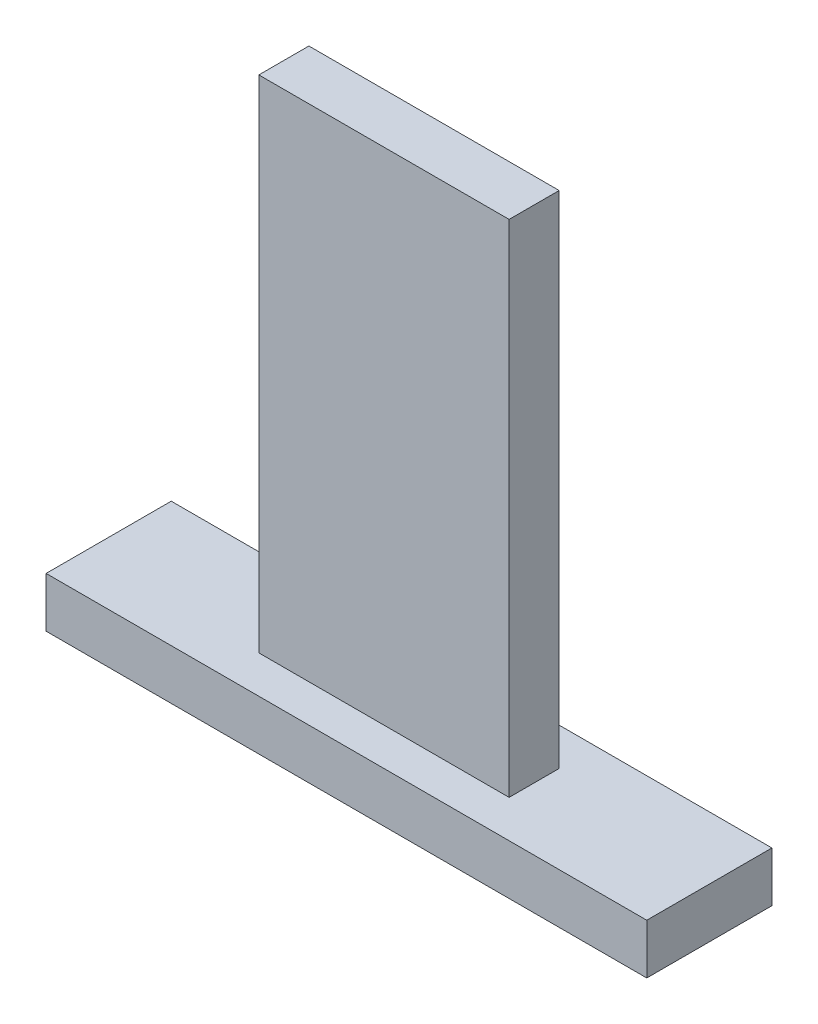
ISO-10303-21;
HEADER;
FILE_DESCRIPTION(('STEP AP214'),'2;1');
FILE_NAME('part.step','',(''),(''),'','','');
FILE_SCHEMA(('AUTOMOTIVE_DESIGN { 1 0 10303 214 1 1 1 1 }'));
ENDSEC;
DATA;
#1=APPLICATION_CONTEXT('core data for automotive mechanical design processes');
#2=APPLICATION_PROTOCOL_DEFINITION('international standard','automotive_design',2000,#1);
#3=PRODUCT_CONTEXT('',#1,'mechanical');
#4=PRODUCT('Part','Part','',(#3));
#5=PRODUCT_RELATED_PRODUCT_CATEGORY('part','',(#4));
#6=PRODUCT_DEFINITION_FORMATION('','',#4);
#7=PRODUCT_DEFINITION_CONTEXT('part definition',#1,'design');
#8=PRODUCT_DEFINITION('design','',#6,#7);
#9=PRODUCT_DEFINITION_SHAPE('','',#8);
#10=(LENGTH_UNIT() NAMED_UNIT(*) SI_UNIT(.MILLI.,.METRE.));
#11=(NAMED_UNIT(*) PLANE_ANGLE_UNIT() SI_UNIT($,.RADIAN.));
#12=(NAMED_UNIT(*) SI_UNIT($,.STERADIAN.) SOLID_ANGLE_UNIT());
#13=UNCERTAINTY_MEASURE_WITH_UNIT(LENGTH_MEASURE(1.E-05),#10,'distance_accuracy_value','');
#14=(GEOMETRIC_REPRESENTATION_CONTEXT(3) GLOBAL_UNCERTAINTY_ASSIGNED_CONTEXT((#13)) GLOBAL_UNIT_ASSIGNED_CONTEXT((#10,
#11,#12)) REPRESENTATION_CONTEXT('',''));
#15=CARTESIAN_POINT('',(0.,0.,0.));
#16=DIRECTION('',(0.,0.,1.));
#17=DIRECTION('',(1.,0.,0.));
#18=AXIS2_PLACEMENT_3D('',#15,#16,#17);
#19=CARTESIAN_POINT('',(-500.,1000.,200.));
#20=DIRECTION('',(1.,0.,0.));
#21=DIRECTION('',(0.,0.,-1.));
#22=AXIS2_PLACEMENT_3D('',#19,#20,#21);
#23=PLANE('',#22);
#24=DIRECTION('',(0.,-1.,0.));
#25=VECTOR('',#24,1.);
#26=CARTESIAN_POINT('',(-500.,1000.,0.));
#27=LINE('',#26,#25);
#28=CARTESIAN_POINT('',(-500.,1000.,0.));
#29=VERTEX_POINT('',#28);
#30=CARTESIAN_POINT('',(-500.,-1000.,0.));
#31=VERTEX_POINT('',#30);
#32=EDGE_CURVE('E132',#29,#31,#27,.T.);
#33=ORIENTED_EDGE('',*,*,#32,.T.);
#34=DIRECTION('',(0.,0.,-1.));
#35=VECTOR('',#34,1.);
#36=CARTESIAN_POINT('',(-500.,-1000.,200.));
#37=LINE('',#36,#35);
#38=CARTESIAN_POINT('',(-500.,-1000.,200.));
#39=VERTEX_POINT('',#38);
#40=EDGE_CURVE('E11',#39,#31,#37,.T.);
#41=ORIENTED_EDGE('',*,*,#40,.F.);
#42=DIRECTION('',(0.,-1.,0.));
#43=VECTOR('',#42,1.);
#44=CARTESIAN_POINT('',(-500.,1000.,200.));
#45=LINE('',#44,#43);
#46=CARTESIAN_POINT('',(-500.,1000.,200.));
#47=VERTEX_POINT('',#46);
#48=EDGE_CURVE('E77',#47,#39,#45,.T.);
#49=ORIENTED_EDGE('',*,*,#48,.F.);
#50=DIRECTION('',(0.,0.,-1.));
#51=VECTOR('',#50,1.);
#52=CARTESIAN_POINT('',(-500.,1000.,200.));
#53=LINE('',#52,#51);
#54=EDGE_CURVE('E146',#47,#29,#53,.T.);
#55=ORIENTED_EDGE('',*,*,#54,.T.);
#56=EDGE_LOOP('',(#33,#41,#49,#55));
#57=FACE_BOUND('',#56,.T.);
#58=ADVANCED_FACE('F35',(#57),#23,.F.);
#59=CARTESIAN_POINT('',(500.,1000.,200.));
#60=DIRECTION('',(-1.,0.,0.));
#61=DIRECTION('',(0.,-1.,0.));
#62=AXIS2_PLACEMENT_3D('',#59,#60,#61);
#63=PLANE('',#62);
#64=DIRECTION('',(0.,1.,0.));
#65=VECTOR('',#64,1.);
#66=CARTESIAN_POINT('',(500.,1000.,0.));
#67=LINE('',#66,#65);
#68=CARTESIAN_POINT('',(500.000000000001,-1000.,0.));
#69=VERTEX_POINT('',#68);
#70=CARTESIAN_POINT('',(500.,1000.,0.));
#71=VERTEX_POINT('',#70);
#72=EDGE_CURVE('E66',#69,#71,#67,.T.);
#73=ORIENTED_EDGE('',*,*,#72,.T.);
#74=DIRECTION('',(0.,0.,-1.));
#75=VECTOR('',#74,1.);
#76=CARTESIAN_POINT('',(500.,1000.,200.));
#77=LINE('',#76,#75);
#78=CARTESIAN_POINT('',(500.,1000.,200.));
#79=VERTEX_POINT('',#78);
#80=EDGE_CURVE('E153',#79,#71,#77,.T.);
#81=ORIENTED_EDGE('',*,*,#80,.F.);
#82=DIRECTION('',(0.,1.,0.));
#83=VECTOR('',#82,1.);
#84=CARTESIAN_POINT('',(500.,1000.,200.));
#85=LINE('',#84,#83);
#86=CARTESIAN_POINT('',(500.000000000001,-1000.,200.));
#87=VERTEX_POINT('',#86);
#88=EDGE_CURVE('E144',#87,#79,#85,.T.);
#89=ORIENTED_EDGE('',*,*,#88,.F.);
#90=DIRECTION('',(0.,0.,-1.));
#91=VECTOR('',#90,1.);
#92=CARTESIAN_POINT('',(500.000000000001,-1000.,200.));
#93=LINE('',#92,#91);
#94=EDGE_CURVE('E43',#87,#69,#93,.T.);
#95=ORIENTED_EDGE('',*,*,#94,.T.);
#96=EDGE_LOOP('',(#73,#81,#89,#95));
#97=FACE_BOUND('',#96,.T.);
#98=ADVANCED_FACE('F156',(#97),#63,.F.);
#99=CARTESIAN_POINT('',(-500.,1000.,200.));
#100=DIRECTION('',(0.,-1.,0.));
#101=DIRECTION('',(0.,0.,-1.));
#102=AXIS2_PLACEMENT_3D('',#99,#100,#101);
#103=PLANE('',#102);
#104=DIRECTION('',(-1.,0.,0.));
#105=VECTOR('',#104,1.);
#106=CARTESIAN_POINT('',(-500.,1000.,0.));
#107=LINE('',#106,#105);
#108=EDGE_CURVE('E72',#71,#29,#107,.T.);
#109=ORIENTED_EDGE('',*,*,#108,.T.);
#110=ORIENTED_EDGE('',*,*,#54,.F.);
#111=DIRECTION('',(-1.,0.,0.));
#112=VECTOR('',#111,1.);
#113=CARTESIAN_POINT('',(-500.,1000.,200.));
#114=LINE('',#113,#112);
#115=EDGE_CURVE('E51',#79,#47,#114,.T.);
#116=ORIENTED_EDGE('',*,*,#115,.F.);
#117=ORIENTED_EDGE('',*,*,#80,.T.);
#118=EDGE_LOOP('',(#109,#110,#116,#117));
#119=FACE_BOUND('',#118,.T.);
#120=ADVANCED_FACE('F165',(#119),#103,.F.);
#121=CARTESIAN_POINT('',(0.,0.,200.));
#122=DIRECTION('',(0.,0.,1.));
#123=DIRECTION('',(1.,0.,0.));
#124=AXIS2_PLACEMENT_3D('',#121,#122,#123);
#125=PLANE('',#124);
#126=ORIENTED_EDGE('',*,*,#48,.T.);
#127=DIRECTION('',(1.,0.,0.));
#128=VECTOR('',#127,1.);
#129=CARTESIAN_POINT('',(-500.,-1000.,200.));
#130=LINE('',#129,#128);
#131=EDGE_CURVE('E142',#39,#87,#130,.T.);
#132=ORIENTED_EDGE('',*,*,#131,.T.);
#133=ORIENTED_EDGE('',*,*,#88,.T.);
#134=ORIENTED_EDGE('',*,*,#115,.T.);
#135=EDGE_LOOP('',(#126,#132,#133,#134));
#136=FACE_BOUND('',#135,.T.);
#137=ADVANCED_FACE('F167',(#136),#125,.T.);
#138=CARTESIAN_POINT('',(0.,0.,0.));
#139=DIRECTION('',(0.,0.,1.));
#140=DIRECTION('',(1.,0.,0.));
#141=AXIS2_PLACEMENT_3D('',#138,#139,#140);
#142=PLANE('',#141);
#143=ORIENTED_EDGE('',*,*,#32,.F.);
#144=ORIENTED_EDGE('',*,*,#108,.F.);
#145=ORIENTED_EDGE('',*,*,#72,.F.);
#146=DIRECTION('',(1.,0.,0.));
#147=VECTOR('',#146,1.);
#148=CARTESIAN_POINT('',(-500.,-1000.,0.));
#149=LINE('',#148,#147);
#150=EDGE_CURVE('E135',#31,#69,#149,.T.);
#151=ORIENTED_EDGE('',*,*,#150,.F.);
#152=EDGE_LOOP('',(#143,#144,#145,#151));
#153=FACE_BOUND('',#152,.T.);
#154=ADVANCED_FACE('F163',(#153),#142,.F.);
#155=CARTESIAN_POINT('',(-1200.,-1200.,350.));
#156=DIRECTION('',(1.,0.,0.));
#157=DIRECTION('',(0.,1.,0.));
#158=AXIS2_PLACEMENT_3D('',#155,#156,#157);
#159=PLANE('',#158);
#160=DIRECTION('',(0.,0.,-1.));
#161=VECTOR('',#160,1.);
#162=CARTESIAN_POINT('',(-1200.,-1000.,350.));
#163=LINE('',#162,#161);
#164=CARTESIAN_POINT('',(-1200.,-1000.,350.));
#165=VERTEX_POINT('',#164);
#166=CARTESIAN_POINT('',(-1200.,-1000.,-150.));
#167=VERTEX_POINT('',#166);
#168=EDGE_CURVE('E131',#165,#167,#163,.T.);
#169=ORIENTED_EDGE('',*,*,#168,.T.);
#170=DIRECTION('',(0.,1.,0.));
#171=VECTOR('',#170,1.);
#172=CARTESIAN_POINT('',(-1200.,-1200.,-150.));
#173=LINE('',#172,#171);
#174=CARTESIAN_POINT('',(-1200.,-1200.,-150.));
#175=VERTEX_POINT('',#174);
#176=EDGE_CURVE('E111',#175,#167,#173,.T.);
#177=ORIENTED_EDGE('',*,*,#176,.F.);
#178=DIRECTION('',(0.,0.,-1.));
#179=VECTOR('',#178,1.);
#180=CARTESIAN_POINT('',(-1200.,-1200.,350.));
#181=LINE('',#180,#179);
#182=CARTESIAN_POINT('',(-1200.,-1200.,350.));
#183=VERTEX_POINT('',#182);
#184=EDGE_CURVE('E118',#183,#175,#181,.T.);
#185=ORIENTED_EDGE('',*,*,#184,.F.);
#186=DIRECTION('',(0.,1.,0.));
#187=VECTOR('',#186,1.);
#188=CARTESIAN_POINT('',(-1200.,-1200.,350.));
#189=LINE('',#188,#187);
#190=EDGE_CURVE('E254',#183,#165,#189,.T.);
#191=ORIENTED_EDGE('',*,*,#190,.T.);
#192=EDGE_LOOP('',(#169,#177,#185,#191));
#193=FACE_BOUND('',#192,.T.);
#194=ADVANCED_FACE('F129',(#193),#159,.F.);
#195=CARTESIAN_POINT('',(-1200.,-1200.,-150.));
#196=DIRECTION('',(0.,0.,1.));
#197=DIRECTION('',(1.,0.,0.));
#198=AXIS2_PLACEMENT_3D('',#195,#196,#197);
#199=PLANE('',#198);
#200=DIRECTION('',(1.,0.,0.));
#201=VECTOR('',#200,1.);
#202=CARTESIAN_POINT('',(-1200.,-1000.,-150.));
#203=LINE('',#202,#201);
#204=CARTESIAN_POINT('',(1200.,-1000.,-150.));
#205=VERTEX_POINT('',#204);
#206=EDGE_CURVE('E260',#167,#205,#203,.T.);
#207=ORIENTED_EDGE('',*,*,#206,.T.);
#208=DIRECTION('',(0.,1.,0.));
#209=VECTOR('',#208,1.);
#210=CARTESIAN_POINT('',(1200.,-1200.,-150.));
#211=LINE('',#210,#209);
#212=CARTESIAN_POINT('',(1200.,-1200.,-150.));
#213=VERTEX_POINT('',#212);
#214=EDGE_CURVE('E114',#213,#205,#211,.T.);
#215=ORIENTED_EDGE('',*,*,#214,.F.);
#216=DIRECTION('',(1.,0.,0.));
#217=VECTOR('',#216,1.);
#218=CARTESIAN_POINT('',(-1200.,-1200.,-150.));
#219=LINE('',#218,#217);
#220=EDGE_CURVE('E107',#175,#213,#219,.T.);
#221=ORIENTED_EDGE('',*,*,#220,.F.);
#222=ORIENTED_EDGE('',*,*,#176,.T.);
#223=EDGE_LOOP('',(#207,#215,#221,#222));
#224=FACE_BOUND('',#223,.T.);
#225=ADVANCED_FACE('F109',(#224),#199,.F.);
#226=CARTESIAN_POINT('',(1200.,-1200.,350.000000000001));
#227=DIRECTION('',(-1.,0.,0.));
#228=DIRECTION('',(0.,0.,1.));
#229=AXIS2_PLACEMENT_3D('',#226,#227,#228);
#230=PLANE('',#229);
#231=DIRECTION('',(0.,0.,1.));
#232=VECTOR('',#231,1.);
#233=CARTESIAN_POINT('',(1200.,-1000.,350.000000000001));
#234=LINE('',#233,#232);
#235=CARTESIAN_POINT('',(1200.,-1000.,350.000000000001));
#236=VERTEX_POINT('',#235);
#237=EDGE_CURVE('E257',#205,#236,#234,.T.);
#238=ORIENTED_EDGE('',*,*,#237,.T.);
#239=DIRECTION('',(0.,1.,0.));
#240=VECTOR('',#239,1.);
#241=CARTESIAN_POINT('',(1200.,-1200.,350.000000000001));
#242=LINE('',#241,#240);
#243=CARTESIAN_POINT('',(1200.,-1200.,350.000000000001));
#244=VERTEX_POINT('',#243);
#245=EDGE_CURVE('E137',#244,#236,#242,.T.);
#246=ORIENTED_EDGE('',*,*,#245,.F.);
#247=DIRECTION('',(0.,0.,1.));
#248=VECTOR('',#247,1.);
#249=CARTESIAN_POINT('',(1200.,-1200.,350.000000000001));
#250=LINE('',#249,#248);
#251=EDGE_CURVE('E117',#213,#244,#250,.T.);
#252=ORIENTED_EDGE('',*,*,#251,.F.);
#253=ORIENTED_EDGE('',*,*,#214,.T.);
#254=EDGE_LOOP('',(#238,#246,#252,#253));
#255=FACE_BOUND('',#254,.T.);
#256=ADVANCED_FACE('F213',(#255),#230,.F.);
#257=CARTESIAN_POINT('',(-1200.,-1200.,350.));
#258=DIRECTION('',(0.,0.,-1.));
#259=DIRECTION('',(-1.,0.,0.));
#260=AXIS2_PLACEMENT_3D('',#257,#258,#259);
#261=PLANE('',#260);
#262=DIRECTION('',(-1.,0.,0.));
#263=VECTOR('',#262,1.);
#264=CARTESIAN_POINT('',(-1200.,-1000.,350.));
#265=LINE('',#264,#263);
#266=EDGE_CURVE('E127',#236,#165,#265,.T.);
#267=ORIENTED_EDGE('',*,*,#266,.T.);
#268=ORIENTED_EDGE('',*,*,#190,.F.);
#269=DIRECTION('',(-1.,0.,0.));
#270=VECTOR('',#269,1.);
#271=CARTESIAN_POINT('',(-1200.,-1200.,350.));
#272=LINE('',#271,#270);
#273=EDGE_CURVE('E123',#244,#183,#272,.T.);
#274=ORIENTED_EDGE('',*,*,#273,.F.);
#275=ORIENTED_EDGE('',*,*,#245,.T.);
#276=EDGE_LOOP('',(#267,#268,#274,#275));
#277=FACE_BOUND('',#276,.T.);
#278=ADVANCED_FACE('F222',(#277),#261,.F.);
#279=CARTESIAN_POINT('',(1.60982338570648E-13,-1200.,0.));
#280=DIRECTION('',(0.,-1.,0.));
#281=DIRECTION('',(1.,0.,0.));
#282=AXIS2_PLACEMENT_3D('',#279,#280,#281);
#283=PLANE('',#282);
#284=ORIENTED_EDGE('',*,*,#184,.T.);
#285=ORIENTED_EDGE('',*,*,#220,.T.);
#286=ORIENTED_EDGE('',*,*,#251,.T.);
#287=ORIENTED_EDGE('',*,*,#273,.T.);
#288=EDGE_LOOP('',(#284,#285,#286,#287));
#289=FACE_BOUND('',#288,.T.);
#290=ADVANCED_FACE('F121',(#289),#283,.T.);
#291=CARTESIAN_POINT('',(1.38777878078145E-13,-1000.,0.));
#292=DIRECTION('',(0.,-1.,0.));
#293=DIRECTION('',(1.,0.,0.));
#294=AXIS2_PLACEMENT_3D('',#291,#292,#293);
#295=PLANE('',#294);
#296=ORIENTED_EDGE('',*,*,#131,.F.);
#297=ORIENTED_EDGE('',*,*,#40,.T.);
#298=ORIENTED_EDGE('',*,*,#150,.T.);
#299=ORIENTED_EDGE('',*,*,#94,.F.);
#300=EDGE_LOOP('',(#296,#297,#298,#299));
#301=FACE_BOUND('',#300,.T.);
#302=ORIENTED_EDGE('',*,*,#168,.F.);
#303=ORIENTED_EDGE('',*,*,#266,.F.);
#304=ORIENTED_EDGE('',*,*,#237,.F.);
#305=ORIENTED_EDGE('',*,*,#206,.F.);
#306=EDGE_LOOP('',(#302,#303,#304,#305));
#307=FACE_BOUND('',#306,.T.);
#308=ADVANCED_FACE('F159',(#301,#307),#295,.F.);
#309=CLOSED_SHELL('',(#58,#98,#120,#137,#154,#194,#225,#256,#278,#290,#308));
#310=MANIFOLD_SOLID_BREP('B2',#309);
#311=ADVANCED_BREP_SHAPE_REPRESENTATION('',(#18,#310),#14);
#312=SHAPE_DEFINITION_REPRESENTATION(#9,#311);
ENDSEC;
END-ISO-10303-21;
